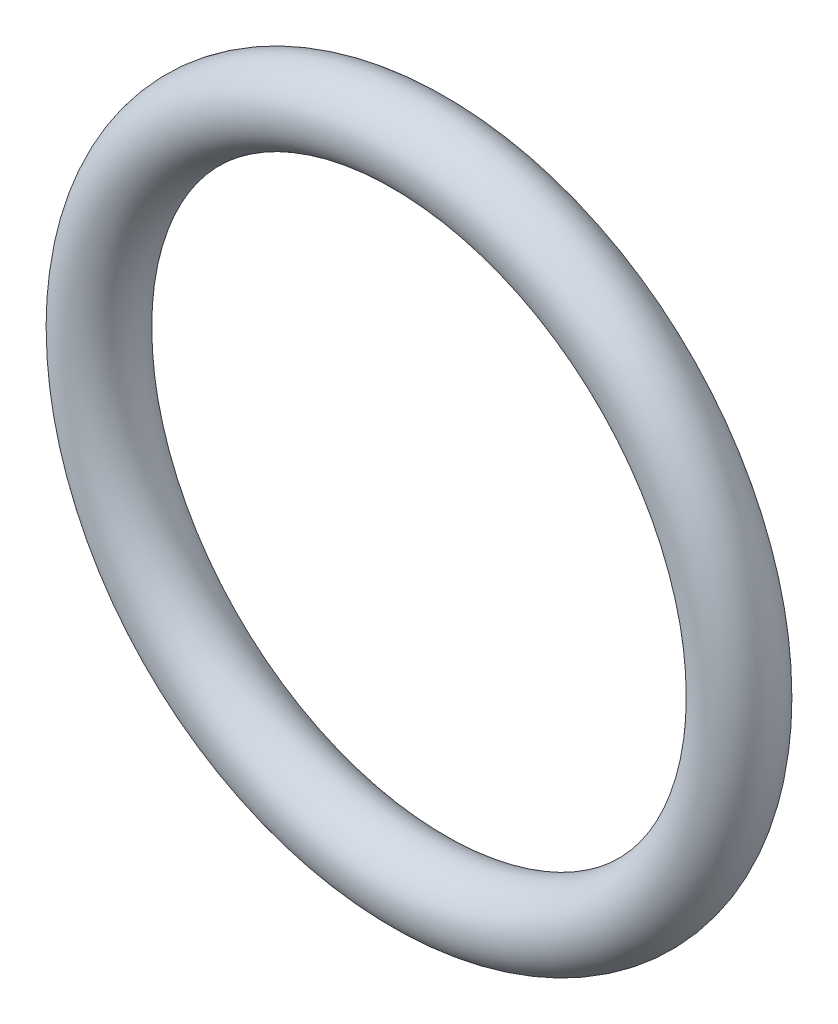
ISO-10303-21;
HEADER;
FILE_DESCRIPTION(('STEP AP214'),'2;1');
FILE_NAME('part.step','',(''),(''),'','','');
FILE_SCHEMA(('AUTOMOTIVE_DESIGN { 1 0 10303 214 1 1 1 1 }'));
ENDSEC;
DATA;
#1=APPLICATION_CONTEXT('core data for automotive mechanical design processes');
#2=APPLICATION_PROTOCOL_DEFINITION('international standard','automotive_design',2000,#1);
#3=PRODUCT_CONTEXT('',#1,'mechanical');
#4=PRODUCT('Part','Part','',(#3));
#5=PRODUCT_RELATED_PRODUCT_CATEGORY('part','',(#4));
#6=PRODUCT_DEFINITION_FORMATION('','',#4);
#7=PRODUCT_DEFINITION_CONTEXT('part definition',#1,'design');
#8=PRODUCT_DEFINITION('design','',#6,#7);
#9=PRODUCT_DEFINITION_SHAPE('','',#8);
#10=(LENGTH_UNIT() NAMED_UNIT(*) SI_UNIT(.MILLI.,.METRE.));
#11=(NAMED_UNIT(*) PLANE_ANGLE_UNIT() SI_UNIT($,.RADIAN.));
#12=(NAMED_UNIT(*) SI_UNIT($,.STERADIAN.) SOLID_ANGLE_UNIT());
#13=UNCERTAINTY_MEASURE_WITH_UNIT(LENGTH_MEASURE(1.E-05),#10,'distance_accuracy_value','');
#14=(GEOMETRIC_REPRESENTATION_CONTEXT(3) GLOBAL_UNCERTAINTY_ASSIGNED_CONTEXT((#13)) GLOBAL_UNIT_ASSIGNED_CONTEXT((#10,
#11,#12)) REPRESENTATION_CONTEXT('',''));
#15=CARTESIAN_POINT('',(0.,0.,0.));
#16=DIRECTION('',(0.,0.,1.));
#17=DIRECTION('',(1.,0.,0.));
#18=AXIS2_PLACEMENT_3D('',#15,#16,#17);
#19=CARTESIAN_POINT('',(0.,0.,0.));
#20=DIRECTION('',(0.,0.,1.));
#21=DIRECTION('',(1.,0.,0.));
#22=AXIS2_PLACEMENT_3D('',#19,#20,#21);
#23=TOROIDAL_SURFACE('',#22,14.775,1.725);
#24=CARTESIAN_POINT('',(16.5,0.,0.));
#25=VERTEX_POINT('',#24);
#26=VERTEX_LOOP('',#25);
#27=FACE_BOUND('',#26,.T.);
#28=ADVANCED_FACE('F31',(#27),#23,.T.);
#29=CLOSED_SHELL('',(#28));
#30=MANIFOLD_SOLID_BREP('B2',#29);
#31=ADVANCED_BREP_SHAPE_REPRESENTATION('',(#18,#30),#14);
#32=SHAPE_DEFINITION_REPRESENTATION(#9,#31);
ENDSEC;
END-ISO-10303-21;
